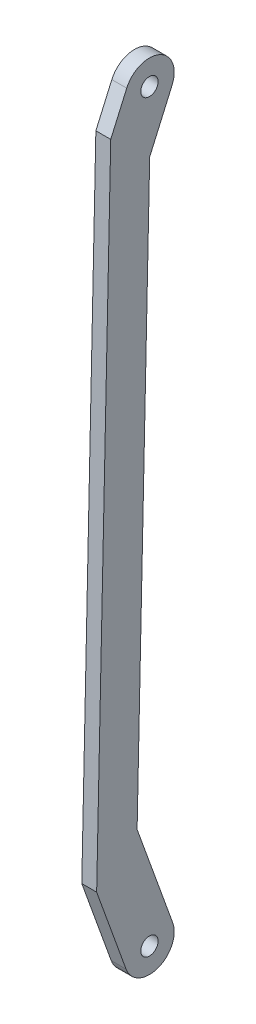
ISO-10303-21;
HEADER;
FILE_DESCRIPTION(('STEP AP214'),'2;1');
FILE_NAME('part.step','',(''),(''),'','','');
FILE_SCHEMA(('AUTOMOTIVE_DESIGN { 1 0 10303 214 1 1 1 1 }'));
ENDSEC;
DATA;
#1=APPLICATION_CONTEXT('core data for automotive mechanical design processes');
#2=APPLICATION_PROTOCOL_DEFINITION('international standard','automotive_design',2000,#1);
#3=PRODUCT_CONTEXT('',#1,'mechanical');
#4=PRODUCT('Part','Part','',(#3));
#5=PRODUCT_RELATED_PRODUCT_CATEGORY('part','',(#4));
#6=PRODUCT_DEFINITION_FORMATION('','',#4);
#7=PRODUCT_DEFINITION_CONTEXT('part definition',#1,'design');
#8=PRODUCT_DEFINITION('design','',#6,#7);
#9=PRODUCT_DEFINITION_SHAPE('','',#8);
#10=(LENGTH_UNIT() NAMED_UNIT(*) SI_UNIT(.MILLI.,.METRE.));
#11=(NAMED_UNIT(*) PLANE_ANGLE_UNIT() SI_UNIT($,.RADIAN.));
#12=(NAMED_UNIT(*) SI_UNIT($,.STERADIAN.) SOLID_ANGLE_UNIT());
#13=UNCERTAINTY_MEASURE_WITH_UNIT(LENGTH_MEASURE(1.E-05),#10,'distance_accuracy_value','');
#14=(GEOMETRIC_REPRESENTATION_CONTEXT(3) GLOBAL_UNCERTAINTY_ASSIGNED_CONTEXT((#13)) GLOBAL_UNIT_ASSIGNED_CONTEXT((#10,
#11,#12)) REPRESENTATION_CONTEXT('',''));
#15=CARTESIAN_POINT('',(0.,0.,0.));
#16=DIRECTION('',(0.,0.,1.));
#17=DIRECTION('',(1.,0.,0.));
#18=AXIS2_PLACEMENT_3D('',#15,#16,#17);
#19=CARTESIAN_POINT('',(3.,0.0939442630747966,-0.000882630359595802));
#20=DIRECTION('',(1.,0.,0.));
#21=DIRECTION('',(0.,0.,-1.));
#22=AXIS2_PLACEMENT_3D('',#19,#20,#21);
#23=PLANE('',#22);
#24=CARTESIAN_POINT('',(3.,150.093944263075,-0.000882630359595802));
#25=DIRECTION('',(1.,0.,0.));
#26=DIRECTION('',(0.,0.,-1.));
#27=AXIS2_PLACEMENT_3D('',#24,#25,#26);
#28=CIRCLE('',#27,1.75);
#29=CARTESIAN_POINT('',(3.,150.093944263075,-1.7508826303596));
#30=VERTEX_POINT('',#29);
#31=EDGE_CURVE('E133',#30,#30,#28,.T.);
#32=ORIENTED_EDGE('',*,*,#31,.F.);
#33=EDGE_LOOP('',(#32));
#34=FACE_BOUND('',#33,.T.);
#35=CARTESIAN_POINT('',(3.,0.0939442630747966,-0.000882630359595802));
#36=DIRECTION('',(1.,0.,0.));
#37=DIRECTION('',(0.,0.,-1.));
#38=AXIS2_PLACEMENT_3D('',#35,#36,#37);
#39=CIRCLE('',#38,4.99999999999998);
#40=CARTESIAN_POINT('',(3.,-1.60577323819639,4.70134667241502));
#41=VERTEX_POINT('',#40);
#42=CARTESIAN_POINT('',(3.,1.79366176434599,-4.7031119331342));
#43=VERTEX_POINT('',#42);
#44=EDGE_CURVE('E144',#41,#43,#39,.T.);
#45=ORIENTED_EDGE('',*,*,#44,.T.);
#46=DIRECTION('',(0.,0.940445860554926,0.33994350025424));
#47=VECTOR('',#46,1.);
#48=CARTESIAN_POINT('',(3.,1.79366176434599,-4.7031119331342));
#49=LINE('',#48,#47);
#50=CARTESIAN_POINT('',(3.,21.6730462996405,2.48270050463912));
#51=VERTEX_POINT('',#50);
#52=EDGE_CURVE('E92',#43,#51,#49,.T.);
#53=ORIENTED_EDGE('',*,*,#52,.T.);
#54=DIRECTION('',(0.,0.999761588430456,-0.0218349787957818));
#55=VECTOR('',#54,1.);
#56=CARTESIAN_POINT('',(3.,21.6730462996405,2.48270050463912));
#57=LINE('',#56,#55);
#58=CARTESIAN_POINT('',(3.,137.784671118326,-0.0531989489896104));
#59=VERTEX_POINT('',#58);
#60=EDGE_CURVE('E159',#51,#59,#57,.T.);
#61=ORIENTED_EDGE('',*,*,#60,.T.);
#62=DIRECTION('',(0.,0.915504914002191,-0.402306788953208));
#63=VECTOR('',#62,1.);
#64=CARTESIAN_POINT('',(3.,137.784671118326,-0.0531989489896104));
#65=LINE('',#64,#63);
#66=CARTESIAN_POINT('',(3.,148.082410318309,-4.57840720037057));
#67=VERTEX_POINT('',#66);
#68=EDGE_CURVE('E172',#59,#67,#65,.T.);
#69=ORIENTED_EDGE('',*,*,#68,.T.);
#70=CARTESIAN_POINT('',(3.,150.093944263075,-0.000882630359595802));
#71=DIRECTION('',(1.,0.,0.));
#72=DIRECTION('',(0.,0.,-1.));
#73=AXIS2_PLACEMENT_3D('',#70,#71,#72);
#74=CIRCLE('',#73,5.);
#75=CARTESIAN_POINT('',(3.,152.105478207841,4.57664193965139));
#76=VERTEX_POINT('',#75);
#77=EDGE_CURVE('E111',#67,#76,#74,.T.);
#78=ORIENTED_EDGE('',*,*,#77,.T.);
#79=DIRECTION('',(0.,-0.915504914002196,0.402306788953196));
#80=VECTOR('',#79,1.);
#81=CARTESIAN_POINT('',(3.,152.105478207841,4.57664193965139));
#82=LINE('',#81,#80);
#83=CARTESIAN_POINT('',(3.,144.779518768388,7.79594002643428));
#84=VERTEX_POINT('',#83);
#85=EDGE_CURVE('E105',#76,#84,#82,.T.);
#86=ORIENTED_EDGE('',*,*,#85,.T.);
#87=DIRECTION('',(0.,-0.999761588430456,0.0218349787957813));
#88=VECTOR('',#87,1.);
#89=CARTESIAN_POINT('',(3.,14.8082596207231,10.6345364682175));
#90=LINE('',#89,#88);
#91=CARTESIAN_POINT('',(3.,14.8082596207231,10.6345364682175));
#92=VERTEX_POINT('',#91);
#93=EDGE_CURVE('E109',#84,#92,#90,.T.);
#94=ORIENTED_EDGE('',*,*,#93,.T.);
#95=DIRECTION('',(0.,-0.940445860554926,-0.33994350025424));
#96=VECTOR('',#95,1.);
#97=CARTESIAN_POINT('',(3.,-1.60577323819639,4.70134667241502));
#98=LINE('',#97,#96);
#99=EDGE_CURVE('E49',#92,#41,#98,.T.);
#100=ORIENTED_EDGE('',*,*,#99,.T.);
#101=EDGE_LOOP('',(#45,#53,#61,#69,#78,#86,#94,#100));
#102=FACE_BOUND('',#101,.T.);
#103=CARTESIAN_POINT('',(3.,0.0939442630747966,-0.000882630359595802));
#104=DIRECTION('',(1.,0.,0.));
#105=DIRECTION('',(0.,0.,-1.));
#106=AXIS2_PLACEMENT_3D('',#103,#104,#105);
#107=CIRCLE('',#106,1.75);
#108=CARTESIAN_POINT('',(3.,0.0939442630747966,-1.7508826303596));
#109=VERTEX_POINT('',#108);
#110=EDGE_CURVE('E181',#109,#109,#107,.T.);
#111=ORIENTED_EDGE('',*,*,#110,.F.);
#112=EDGE_LOOP('',(#111));
#113=FACE_BOUND('',#112,.T.);
#114=ADVANCED_FACE('F32',(#34,#102,#113),#23,.T.);
#115=CARTESIAN_POINT('',(0.,0.0939442630747966,-0.000882630359595802));
#116=DIRECTION('',(1.,0.,0.));
#117=DIRECTION('',(0.,0.,-1.));
#118=AXIS2_PLACEMENT_3D('',#115,#116,#117);
#119=PLANE('',#118);
#120=CARTESIAN_POINT('',(0.,150.093944263075,-0.000882630359595802));
#121=DIRECTION('',(1.,0.,0.));
#122=DIRECTION('',(0.,0.,-1.));
#123=AXIS2_PLACEMENT_3D('',#120,#121,#122);
#124=CIRCLE('',#123,1.75);
#125=CARTESIAN_POINT('',(0.,150.093944263075,-1.7508826303596));
#126=VERTEX_POINT('',#125);
#127=EDGE_CURVE('E178',#126,#126,#124,.T.);
#128=ORIENTED_EDGE('',*,*,#127,.T.);
#129=EDGE_LOOP('',(#128));
#130=FACE_BOUND('',#129,.T.);
#131=CARTESIAN_POINT('',(0.,0.0939442630747966,-0.000882630359595802));
#132=DIRECTION('',(1.,0.,0.));
#133=DIRECTION('',(0.,0.,-1.));
#134=AXIS2_PLACEMENT_3D('',#131,#132,#133);
#135=CIRCLE('',#134,4.99999999999998);
#136=CARTESIAN_POINT('',(0.,-1.60577323819639,4.70134667241502));
#137=VERTEX_POINT('',#136);
#138=CARTESIAN_POINT('',(0.,1.79366176434599,-4.7031119331342));
#139=VERTEX_POINT('',#138);
#140=EDGE_CURVE('E129',#137,#139,#135,.T.);
#141=ORIENTED_EDGE('',*,*,#140,.F.);
#142=DIRECTION('',(0.,-0.940445860554926,-0.33994350025424));
#143=VECTOR('',#142,1.);
#144=CARTESIAN_POINT('',(0.,-1.60577323819639,4.70134667241502));
#145=LINE('',#144,#143);
#146=CARTESIAN_POINT('',(0.,14.8082596207231,10.6345364682175));
#147=VERTEX_POINT('',#146);
#148=EDGE_CURVE('E84',#147,#137,#145,.T.);
#149=ORIENTED_EDGE('',*,*,#148,.F.);
#150=DIRECTION('',(0.,-0.999761588430456,0.0218349787957813));
#151=VECTOR('',#150,1.);
#152=CARTESIAN_POINT('',(0.,14.8082596207231,10.6345364682175));
#153=LINE('',#152,#151);
#154=CARTESIAN_POINT('',(0.,144.779518768388,7.79594002643428));
#155=VERTEX_POINT('',#154);
#156=EDGE_CURVE('E78',#155,#147,#153,.T.);
#157=ORIENTED_EDGE('',*,*,#156,.F.);
#158=DIRECTION('',(0.,-0.915504914002196,0.402306788953196));
#159=VECTOR('',#158,1.);
#160=CARTESIAN_POINT('',(0.,152.105478207841,4.57664193965139));
#161=LINE('',#160,#159);
#162=CARTESIAN_POINT('',(0.,152.105478207841,4.57664193965139));
#163=VERTEX_POINT('',#162);
#164=EDGE_CURVE('E119',#163,#155,#161,.T.);
#165=ORIENTED_EDGE('',*,*,#164,.F.);
#166=CARTESIAN_POINT('',(0.,150.093944263075,-0.000882630359595802));
#167=DIRECTION('',(1.,0.,0.));
#168=DIRECTION('',(0.,0.,-1.));
#169=AXIS2_PLACEMENT_3D('',#166,#167,#168);
#170=CIRCLE('',#169,5.);
#171=CARTESIAN_POINT('',(0.,148.082410318309,-4.57840720037057));
#172=VERTEX_POINT('',#171);
#173=EDGE_CURVE('E139',#172,#163,#170,.T.);
#174=ORIENTED_EDGE('',*,*,#173,.F.);
#175=DIRECTION('',(0.,0.915504914002191,-0.402306788953208));
#176=VECTOR('',#175,1.);
#177=CARTESIAN_POINT('',(0.,137.784671118326,-0.0531989489896104));
#178=LINE('',#177,#176);
#179=CARTESIAN_POINT('',(0.,137.784671118326,-0.0531989489896104));
#180=VERTEX_POINT('',#179);
#181=EDGE_CURVE('E137',#180,#172,#178,.T.);
#182=ORIENTED_EDGE('',*,*,#181,.F.);
#183=DIRECTION('',(0.,0.999761588430456,-0.0218349787957818));
#184=VECTOR('',#183,1.);
#185=CARTESIAN_POINT('',(0.,21.6730462996405,2.48270050463912));
#186=LINE('',#185,#184);
#187=CARTESIAN_POINT('',(0.,21.6730462996405,2.48270050463912));
#188=VERTEX_POINT('',#187);
#189=EDGE_CURVE('E135',#188,#180,#186,.T.);
#190=ORIENTED_EDGE('',*,*,#189,.F.);
#191=DIRECTION('',(0.,0.940445860554926,0.33994350025424));
#192=VECTOR('',#191,1.);
#193=CARTESIAN_POINT('',(0.,1.79366176434599,-4.7031119331342));
#194=LINE('',#193,#192);
#195=EDGE_CURVE('E132',#139,#188,#194,.T.);
#196=ORIENTED_EDGE('',*,*,#195,.F.);
#197=EDGE_LOOP('',(#141,#149,#157,#165,#174,#182,#190,#196));
#198=FACE_BOUND('',#197,.T.);
#199=CARTESIAN_POINT('',(0.,0.0939442630747966,-0.000882630359595802));
#200=DIRECTION('',(1.,0.,0.));
#201=DIRECTION('',(0.,0.,-1.));
#202=AXIS2_PLACEMENT_3D('',#199,#200,#201);
#203=CIRCLE('',#202,1.75);
#204=CARTESIAN_POINT('',(0.,0.0939442630747966,-1.7508826303596));
#205=VERTEX_POINT('',#204);
#206=EDGE_CURVE('E184',#205,#205,#203,.T.);
#207=ORIENTED_EDGE('',*,*,#206,.T.);
#208=EDGE_LOOP('',(#207));
#209=FACE_BOUND('',#208,.T.);
#210=ADVANCED_FACE('F163',(#130,#198,#209),#119,.F.);
#211=CARTESIAN_POINT('',(3.,0.0939442630747966,-0.000882630359595802));
#212=DIRECTION('',(-1.,0.,0.));
#213=DIRECTION('',(0.,0.,1.));
#214=AXIS2_PLACEMENT_3D('',#211,#212,#213);
#215=CYLINDRICAL_SURFACE('',#214,4.99999999999998);
#216=ORIENTED_EDGE('',*,*,#140,.T.);
#217=DIRECTION('',(-1.,0.,0.));
#218=VECTOR('',#217,1.);
#219=CARTESIAN_POINT('',(3.,1.79366176434599,-4.7031119331342));
#220=LINE('',#219,#218);
#221=EDGE_CURVE('E11',#43,#139,#220,.T.);
#222=ORIENTED_EDGE('',*,*,#221,.F.);
#223=ORIENTED_EDGE('',*,*,#44,.F.);
#224=DIRECTION('',(-1.,0.,0.));
#225=VECTOR('',#224,1.);
#226=CARTESIAN_POINT('',(3.,-1.60577323819639,4.70134667241502));
#227=LINE('',#226,#225);
#228=EDGE_CURVE('E125',#41,#137,#227,.T.);
#229=ORIENTED_EDGE('',*,*,#228,.T.);
#230=EDGE_LOOP('',(#216,#222,#223,#229));
#231=FACE_BOUND('',#230,.T.);
#232=ADVANCED_FACE('F34',(#231),#215,.T.);
#233=CARTESIAN_POINT('',(3.,1.79366176434599,-4.7031119331342));
#234=DIRECTION('',(0.,-0.33994350025424,0.940445860554926));
#235=DIRECTION('',(0.,-0.940445860554926,-0.33994350025424));
#236=AXIS2_PLACEMENT_3D('',#233,#234,#235);
#237=PLANE('',#236);
#238=ORIENTED_EDGE('',*,*,#195,.T.);
#239=DIRECTION('',(-1.,0.,0.));
#240=VECTOR('',#239,1.);
#241=CARTESIAN_POINT('',(3.,21.6730462996405,2.48270050463912));
#242=LINE('',#241,#240);
#243=EDGE_CURVE('E41',#51,#188,#242,.T.);
#244=ORIENTED_EDGE('',*,*,#243,.F.);
#245=ORIENTED_EDGE('',*,*,#52,.F.);
#246=ORIENTED_EDGE('',*,*,#221,.T.);
#247=EDGE_LOOP('',(#238,#244,#245,#246));
#248=FACE_BOUND('',#247,.T.);
#249=ADVANCED_FACE('F217',(#248),#237,.F.);
#250=CARTESIAN_POINT('',(3.,21.6730462996405,2.48270050463912));
#251=DIRECTION('',(0.,0.0218349787957818,0.999761588430456));
#252=DIRECTION('',(0.,-0.999761588430456,0.0218349787957818));
#253=AXIS2_PLACEMENT_3D('',#250,#251,#252);
#254=PLANE('',#253);
#255=ORIENTED_EDGE('',*,*,#189,.T.);
#256=DIRECTION('',(-1.,0.,0.));
#257=VECTOR('',#256,1.);
#258=CARTESIAN_POINT('',(3.,137.784671118326,-0.0531989489896104));
#259=LINE('',#258,#257);
#260=EDGE_CURVE('E151',#59,#180,#259,.T.);
#261=ORIENTED_EDGE('',*,*,#260,.F.);
#262=ORIENTED_EDGE('',*,*,#60,.F.);
#263=ORIENTED_EDGE('',*,*,#243,.T.);
#264=EDGE_LOOP('',(#255,#261,#262,#263));
#265=FACE_BOUND('',#264,.T.);
#266=ADVANCED_FACE('F157',(#265),#254,.F.);
#267=CARTESIAN_POINT('',(3.,137.784671118326,-0.0531989489896104));
#268=DIRECTION('',(0.,0.402306788953208,0.915504914002191));
#269=DIRECTION('',(0.,-0.915504914002191,0.402306788953208));
#270=AXIS2_PLACEMENT_3D('',#267,#268,#269);
#271=PLANE('',#270);
#272=ORIENTED_EDGE('',*,*,#181,.T.);
#273=DIRECTION('',(-1.,0.,0.));
#274=VECTOR('',#273,1.);
#275=CARTESIAN_POINT('',(3.,148.082410318309,-4.57840720037057));
#276=LINE('',#275,#274);
#277=EDGE_CURVE('E148',#67,#172,#276,.T.);
#278=ORIENTED_EDGE('',*,*,#277,.F.);
#279=ORIENTED_EDGE('',*,*,#68,.F.);
#280=ORIENTED_EDGE('',*,*,#260,.T.);
#281=EDGE_LOOP('',(#272,#278,#279,#280));
#282=FACE_BOUND('',#281,.T.);
#283=ADVANCED_FACE('F168',(#282),#271,.F.);
#284=CARTESIAN_POINT('',(3.,150.093944263075,-0.000882630359595802));
#285=DIRECTION('',(-1.,0.,0.));
#286=DIRECTION('',(0.,0.,1.));
#287=AXIS2_PLACEMENT_3D('',#284,#285,#286);
#288=CYLINDRICAL_SURFACE('',#287,5.);
#289=ORIENTED_EDGE('',*,*,#173,.T.);
#290=DIRECTION('',(-1.,0.,0.));
#291=VECTOR('',#290,1.);
#292=CARTESIAN_POINT('',(3.,152.105478207841,4.57664193965139));
#293=LINE('',#292,#291);
#294=EDGE_CURVE('E120',#76,#163,#293,.T.);
#295=ORIENTED_EDGE('',*,*,#294,.F.);
#296=ORIENTED_EDGE('',*,*,#77,.F.);
#297=ORIENTED_EDGE('',*,*,#277,.T.);
#298=EDGE_LOOP('',(#289,#295,#296,#297));
#299=FACE_BOUND('',#298,.T.);
#300=ADVANCED_FACE('F171',(#299),#288,.T.);
#301=CARTESIAN_POINT('',(3.,152.105478207841,4.57664193965139));
#302=DIRECTION('',(0.,-0.402306788953196,-0.915504914002196));
#303=DIRECTION('',(0.,0.915504914002196,-0.402306788953196));
#304=AXIS2_PLACEMENT_3D('',#301,#302,#303);
#305=PLANE('',#304);
#306=ORIENTED_EDGE('',*,*,#164,.T.);
#307=DIRECTION('',(-1.,0.,0.));
#308=VECTOR('',#307,1.);
#309=CARTESIAN_POINT('',(3.,144.779518768388,7.79594002643428));
#310=LINE('',#309,#308);
#311=EDGE_CURVE('E116',#84,#155,#310,.T.);
#312=ORIENTED_EDGE('',*,*,#311,.F.);
#313=ORIENTED_EDGE('',*,*,#85,.F.);
#314=ORIENTED_EDGE('',*,*,#294,.T.);
#315=EDGE_LOOP('',(#306,#312,#313,#314));
#316=FACE_BOUND('',#315,.T.);
#317=ADVANCED_FACE('F117',(#316),#305,.F.);
#318=CARTESIAN_POINT('',(3.,14.8082596207231,10.6345364682175));
#319=DIRECTION('',(0.,-0.0218349787957813,-0.999761588430456));
#320=DIRECTION('',(0.,0.999761588430456,-0.0218349787957813));
#321=AXIS2_PLACEMENT_3D('',#318,#319,#320);
#322=PLANE('',#321);
#323=ORIENTED_EDGE('',*,*,#156,.T.);
#324=DIRECTION('',(-1.,0.,0.));
#325=VECTOR('',#324,1.);
#326=CARTESIAN_POINT('',(3.,14.8082596207231,10.6345364682175));
#327=LINE('',#326,#325);
#328=EDGE_CURVE('E121',#92,#147,#327,.T.);
#329=ORIENTED_EDGE('',*,*,#328,.F.);
#330=ORIENTED_EDGE('',*,*,#93,.F.);
#331=ORIENTED_EDGE('',*,*,#311,.T.);
#332=EDGE_LOOP('',(#323,#329,#330,#331));
#333=FACE_BOUND('',#332,.T.);
#334=ADVANCED_FACE('F123',(#333),#322,.F.);
#335=CARTESIAN_POINT('',(3.,-1.60577323819639,4.70134667241502));
#336=DIRECTION('',(0.,0.33994350025424,-0.940445860554926));
#337=DIRECTION('',(0.,0.940445860554926,0.339943500254241));
#338=AXIS2_PLACEMENT_3D('',#335,#336,#337);
#339=PLANE('',#338);
#340=ORIENTED_EDGE('',*,*,#148,.T.);
#341=ORIENTED_EDGE('',*,*,#228,.F.);
#342=ORIENTED_EDGE('',*,*,#99,.F.);
#343=ORIENTED_EDGE('',*,*,#328,.T.);
#344=EDGE_LOOP('',(#340,#341,#342,#343));
#345=FACE_BOUND('',#344,.T.);
#346=ADVANCED_FACE('F205',(#345),#339,.F.);
#347=CARTESIAN_POINT('',(3.,150.093944263075,-0.000882630359595802));
#348=DIRECTION('',(-1.,0.,0.));
#349=DIRECTION('',(0.,0.,1.));
#350=AXIS2_PLACEMENT_3D('',#347,#348,#349);
#351=CYLINDRICAL_SURFACE('',#350,1.75);
#352=ORIENTED_EDGE('',*,*,#31,.T.);
#353=EDGE_LOOP('',(#352));
#354=FACE_BOUND('',#353,.T.);
#355=ORIENTED_EDGE('',*,*,#127,.F.);
#356=EDGE_LOOP('',(#355));
#357=FACE_BOUND('',#356,.T.);
#358=ADVANCED_FACE('F202',(#354,#357),#351,.F.);
#359=CARTESIAN_POINT('',(3.,0.0939442630747966,-0.000882630359595802));
#360=DIRECTION('',(-1.,0.,0.));
#361=DIRECTION('',(0.,0.,1.));
#362=AXIS2_PLACEMENT_3D('',#359,#360,#361);
#363=CYLINDRICAL_SURFACE('',#362,1.75);
#364=ORIENTED_EDGE('',*,*,#110,.T.);
#365=EDGE_LOOP('',(#364));
#366=FACE_BOUND('',#365,.T.);
#367=ORIENTED_EDGE('',*,*,#206,.F.);
#368=EDGE_LOOP('',(#367));
#369=FACE_BOUND('',#368,.T.);
#370=ADVANCED_FACE('F190',(#366,#369),#363,.F.);
#371=CLOSED_SHELL('',(#114,#210,#232,#249,#266,#283,#300,#317,#334,#346,#358,#370));
#372=MANIFOLD_SOLID_BREP('B2',#371);
#373=ADVANCED_BREP_SHAPE_REPRESENTATION('',(#18,#372),#14);
#374=SHAPE_DEFINITION_REPRESENTATION(#9,#373);
ENDSEC;
END-ISO-10303-21;
